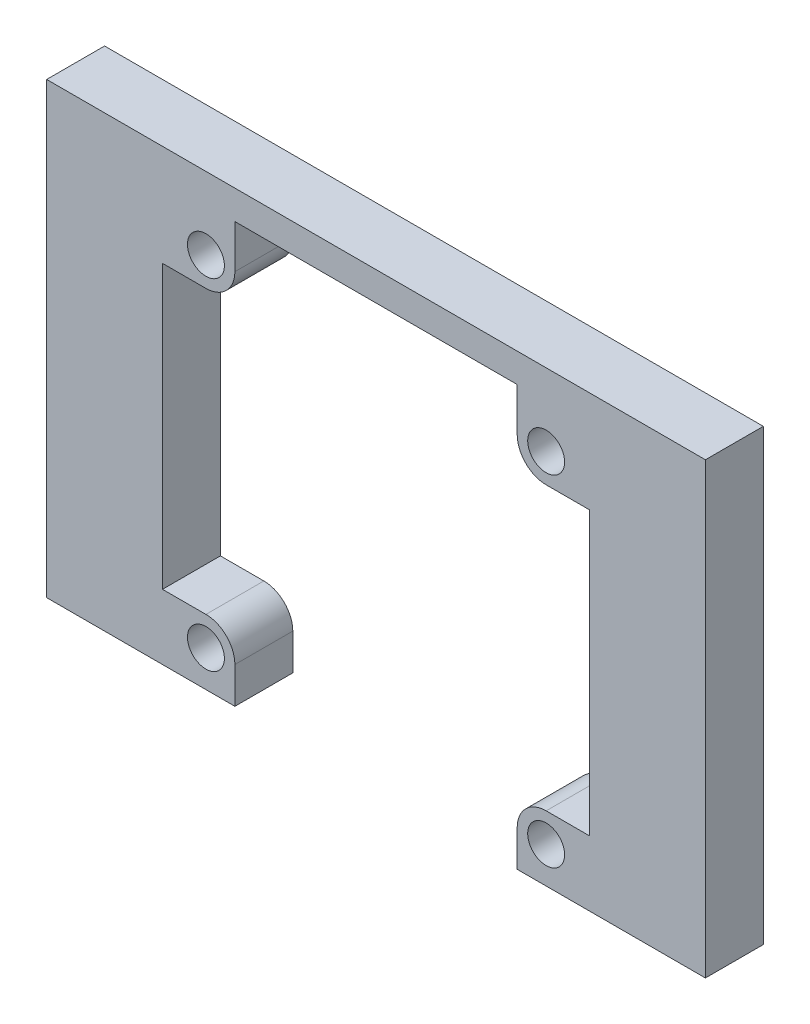
ISO-10303-21;
HEADER;
FILE_DESCRIPTION(('STEP AP214'),'2;1');
FILE_NAME('part.step','',(''),(''),'','','');
FILE_SCHEMA(('AUTOMOTIVE_DESIGN { 1 0 10303 214 1 1 1 1 }'));
ENDSEC;
DATA;
#1=APPLICATION_CONTEXT('core data for automotive mechanical design processes');
#2=APPLICATION_PROTOCOL_DEFINITION('international standard','automotive_design',2000,#1);
#3=PRODUCT_CONTEXT('',#1,'mechanical');
#4=PRODUCT('Part','Part','',(#3));
#5=PRODUCT_RELATED_PRODUCT_CATEGORY('part','',(#4));
#6=PRODUCT_DEFINITION_FORMATION('','',#4);
#7=PRODUCT_DEFINITION_CONTEXT('part definition',#1,'design');
#8=PRODUCT_DEFINITION('design','',#6,#7);
#9=PRODUCT_DEFINITION_SHAPE('','',#8);
#10=(LENGTH_UNIT() NAMED_UNIT(*) SI_UNIT(.MILLI.,.METRE.));
#11=(NAMED_UNIT(*) PLANE_ANGLE_UNIT() SI_UNIT($,.RADIAN.));
#12=(NAMED_UNIT(*) SI_UNIT($,.STERADIAN.) SOLID_ANGLE_UNIT());
#13=UNCERTAINTY_MEASURE_WITH_UNIT(LENGTH_MEASURE(1.E-05),#10,'distance_accuracy_value','');
#14=(GEOMETRIC_REPRESENTATION_CONTEXT(3) GLOBAL_UNCERTAINTY_ASSIGNED_CONTEXT((#13)) GLOBAL_UNIT_ASSIGNED_CONTEXT((#10,
#11,#12)) REPRESENTATION_CONTEXT('',''));
#15=CARTESIAN_POINT('',(0.,0.,0.));
#16=DIRECTION('',(0.,0.,1.));
#17=DIRECTION('',(1.,0.,0.));
#18=AXIS2_PLACEMENT_3D('',#15,#16,#17);
#19=CARTESIAN_POINT('',(45.5,0.,8.));
#20=DIRECTION('',(-1.,0.,0.));
#21=DIRECTION('',(0.,0.,1.));
#22=AXIS2_PLACEMENT_3D('',#19,#20,#21);
#23=PLANE('',#22);
#24=DIRECTION('',(0.,1.,0.));
#25=VECTOR('',#24,1.);
#26=CARTESIAN_POINT('',(45.5,0.,0.));
#27=LINE('',#26,#25);
#28=CARTESIAN_POINT('',(45.5,25.95,0.));
#29=VERTEX_POINT('',#28);
#30=CARTESIAN_POINT('',(45.5,87.95,0.));
#31=VERTEX_POINT('',#30);
#32=EDGE_CURVE('E221',#29,#31,#27,.T.);
#33=ORIENTED_EDGE('',*,*,#32,.T.);
#34=DIRECTION('',(0.,0.,-1.));
#35=VECTOR('',#34,1.);
#36=CARTESIAN_POINT('',(45.5,87.95,8.));
#37=LINE('',#36,#35);
#38=CARTESIAN_POINT('',(45.5,87.95,8.));
#39=VERTEX_POINT('',#38);
#40=EDGE_CURVE('E11',#39,#31,#37,.T.);
#41=ORIENTED_EDGE('',*,*,#40,.F.);
#42=DIRECTION('',(0.,1.,0.));
#43=VECTOR('',#42,1.);
#44=CARTESIAN_POINT('',(45.5,0.,8.));
#45=LINE('',#44,#43);
#46=CARTESIAN_POINT('',(45.5,25.95,8.));
#47=VERTEX_POINT('',#46);
#48=EDGE_CURVE('E133',#47,#39,#45,.T.);
#49=ORIENTED_EDGE('',*,*,#48,.F.);
#50=DIRECTION('',(0.,0.,-1.));
#51=VECTOR('',#50,1.);
#52=CARTESIAN_POINT('',(45.5,25.95,8.));
#53=LINE('',#52,#51);
#54=EDGE_CURVE('E220',#47,#29,#53,.T.);
#55=ORIENTED_EDGE('',*,*,#54,.T.);
#56=EDGE_LOOP('',(#33,#41,#49,#55));
#57=FACE_BOUND('',#56,.T.);
#58=ADVANCED_FACE('F41',(#57),#23,.F.);
#59=CARTESIAN_POINT('',(0.,87.95,8.));
#60=DIRECTION('',(0.,1.,0.));
#61=DIRECTION('',(0.,0.,1.));
#62=AXIS2_PLACEMENT_3D('',#59,#60,#61);
#63=PLANE('',#62);
#64=DIRECTION('',(1.,0.,0.));
#65=VECTOR('',#64,1.);
#66=CARTESIAN_POINT('',(0.,87.95,0.));
#67=LINE('',#66,#65);
#68=CARTESIAN_POINT('',(-45.5,87.95,0.));
#69=VERTEX_POINT('',#68);
#70=EDGE_CURVE('E224',#69,#31,#67,.T.);
#71=ORIENTED_EDGE('',*,*,#70,.F.);
#72=DIRECTION('',(0.,0.,-1.));
#73=VECTOR('',#72,1.);
#74=CARTESIAN_POINT('',(-45.5,87.95,8.));
#75=LINE('',#74,#73);
#76=CARTESIAN_POINT('',(-45.5,87.95,8.));
#77=VERTEX_POINT('',#76);
#78=EDGE_CURVE('E49',#77,#69,#75,.T.);
#79=ORIENTED_EDGE('',*,*,#78,.F.);
#80=DIRECTION('',(1.,0.,0.));
#81=VECTOR('',#80,1.);
#82=CARTESIAN_POINT('',(0.,87.95,8.));
#83=LINE('',#82,#81);
#84=EDGE_CURVE('E341',#77,#39,#83,.T.);
#85=ORIENTED_EDGE('',*,*,#84,.T.);
#86=ORIENTED_EDGE('',*,*,#40,.T.);
#87=EDGE_LOOP('',(#71,#79,#85,#86));
#88=FACE_BOUND('',#87,.T.);
#89=ADVANCED_FACE('F326',(#88),#63,.T.);
#90=CARTESIAN_POINT('',(-45.5,0.,8.));
#91=DIRECTION('',(-1.,0.,0.));
#92=DIRECTION('',(0.,0.,1.));
#93=AXIS2_PLACEMENT_3D('',#90,#91,#92);
#94=PLANE('',#93);
#95=DIRECTION('',(0.,1.,0.));
#96=VECTOR('',#95,1.);
#97=CARTESIAN_POINT('',(-45.5,0.,0.));
#98=LINE('',#97,#96);
#99=CARTESIAN_POINT('',(-45.5,25.95,0.));
#100=VERTEX_POINT('',#99);
#101=EDGE_CURVE('E227',#100,#69,#98,.T.);
#102=ORIENTED_EDGE('',*,*,#101,.F.);
#103=DIRECTION('',(0.,0.,-1.));
#104=VECTOR('',#103,1.);
#105=CARTESIAN_POINT('',(-45.5,25.95,8.));
#106=LINE('',#105,#104);
#107=CARTESIAN_POINT('',(-45.5,25.95,8.));
#108=VERTEX_POINT('',#107);
#109=EDGE_CURVE('E316',#108,#100,#106,.T.);
#110=ORIENTED_EDGE('',*,*,#109,.F.);
#111=DIRECTION('',(0.,1.,0.));
#112=VECTOR('',#111,1.);
#113=CARTESIAN_POINT('',(-45.5,0.,8.));
#114=LINE('',#113,#112);
#115=EDGE_CURVE('E323',#108,#77,#114,.T.);
#116=ORIENTED_EDGE('',*,*,#115,.T.);
#117=ORIENTED_EDGE('',*,*,#78,.T.);
#118=EDGE_LOOP('',(#102,#110,#116,#117));
#119=FACE_BOUND('',#118,.T.);
#120=ADVANCED_FACE('F321',(#119),#94,.T.);
#121=CARTESIAN_POINT('',(0.,25.95,8.));
#122=DIRECTION('',(0.,-1.,0.));
#123=DIRECTION('',(0.,0.,-1.));
#124=AXIS2_PLACEMENT_3D('',#121,#122,#123);
#125=PLANE('',#124);
#126=DIRECTION('',(-1.,0.,0.));
#127=VECTOR('',#126,1.);
#128=CARTESIAN_POINT('',(0.,25.95,0.));
#129=LINE('',#128,#127);
#130=CARTESIAN_POINT('',(-19.5,25.95,0.));
#131=VERTEX_POINT('',#130);
#132=EDGE_CURVE('E230',#131,#100,#129,.T.);
#133=ORIENTED_EDGE('',*,*,#132,.F.);
#134=DIRECTION('',(0.,0.,-1.));
#135=VECTOR('',#134,1.);
#136=CARTESIAN_POINT('',(-19.5,25.95,8.));
#137=LINE('',#136,#135);
#138=CARTESIAN_POINT('',(-19.5,25.95,8.));
#139=VERTEX_POINT('',#138);
#140=EDGE_CURVE('E314',#139,#131,#137,.T.);
#141=ORIENTED_EDGE('',*,*,#140,.F.);
#142=DIRECTION('',(-1.,0.,0.));
#143=VECTOR('',#142,1.);
#144=CARTESIAN_POINT('',(0.,25.95,8.));
#145=LINE('',#144,#143);
#146=EDGE_CURVE('E338',#139,#108,#145,.T.);
#147=ORIENTED_EDGE('',*,*,#146,.T.);
#148=ORIENTED_EDGE('',*,*,#109,.T.);
#149=EDGE_LOOP('',(#133,#141,#147,#148));
#150=FACE_BOUND('',#149,.T.);
#151=ADVANCED_FACE('F335',(#150),#125,.T.);
#152=CARTESIAN_POINT('',(-19.5,0.,8.));
#153=DIRECTION('',(1.,0.,0.));
#154=DIRECTION('',(0.,0.,-1.));
#155=AXIS2_PLACEMENT_3D('',#152,#153,#154);
#156=PLANE('',#155);
#157=DIRECTION('',(0.,-1.,0.));
#158=VECTOR('',#157,1.);
#159=CARTESIAN_POINT('',(-19.5,0.,0.));
#160=LINE('',#159,#158);
#161=CARTESIAN_POINT('',(-19.5,30.95,0.));
#162=VERTEX_POINT('',#161);
#163=EDGE_CURVE('E233',#162,#131,#160,.T.);
#164=ORIENTED_EDGE('',*,*,#163,.F.);
#165=DIRECTION('',(0.,0.,-1.));
#166=VECTOR('',#165,1.);
#167=CARTESIAN_POINT('',(-19.5,30.95,8.));
#168=LINE('',#167,#166);
#169=CARTESIAN_POINT('',(-19.5,30.95,8.));
#170=VERTEX_POINT('',#169);
#171=EDGE_CURVE('E312',#170,#162,#168,.T.);
#172=ORIENTED_EDGE('',*,*,#171,.F.);
#173=DIRECTION('',(0.,-1.,0.));
#174=VECTOR('',#173,1.);
#175=CARTESIAN_POINT('',(-19.5,0.,8.));
#176=LINE('',#175,#174);
#177=EDGE_CURVE('E343',#170,#139,#176,.T.);
#178=ORIENTED_EDGE('',*,*,#177,.T.);
#179=ORIENTED_EDGE('',*,*,#140,.T.);
#180=EDGE_LOOP('',(#164,#172,#178,#179));
#181=FACE_BOUND('',#180,.T.);
#182=ADVANCED_FACE('F405',(#181),#156,.T.);
#183=CARTESIAN_POINT('',(-23.5,30.95,8.));
#184=DIRECTION('',(0.,0.,-1.));
#185=DIRECTION('',(-1.,0.,0.));
#186=AXIS2_PLACEMENT_3D('',#183,#184,#185);
#187=CYLINDRICAL_SURFACE('',#186,4.);
#188=CARTESIAN_POINT('',(-23.5,30.95,0.));
#189=DIRECTION('',(0.,0.,1.));
#190=DIRECTION('',(1.,0.,0.));
#191=AXIS2_PLACEMENT_3D('',#188,#189,#190);
#192=CIRCLE('',#191,4.);
#193=CARTESIAN_POINT('',(-23.5,34.95,0.));
#194=VERTEX_POINT('',#193);
#195=EDGE_CURVE('E236',#162,#194,#192,.T.);
#196=ORIENTED_EDGE('',*,*,#195,.T.);
#197=DIRECTION('',(0.,0.,-1.));
#198=VECTOR('',#197,1.);
#199=CARTESIAN_POINT('',(-23.5,34.95,8.));
#200=LINE('',#199,#198);
#201=CARTESIAN_POINT('',(-23.5,34.95,8.));
#202=VERTEX_POINT('',#201);
#203=EDGE_CURVE('E309',#202,#194,#200,.T.);
#204=ORIENTED_EDGE('',*,*,#203,.F.);
#205=CARTESIAN_POINT('',(-23.5,30.95,8.));
#206=DIRECTION('',(0.,0.,1.));
#207=DIRECTION('',(1.,0.,0.));
#208=AXIS2_PLACEMENT_3D('',#205,#206,#207);
#209=CIRCLE('',#208,4.);
#210=EDGE_CURVE('E349',#170,#202,#209,.T.);
#211=ORIENTED_EDGE('',*,*,#210,.F.);
#212=ORIENTED_EDGE('',*,*,#171,.T.);
#213=EDGE_LOOP('',(#196,#204,#211,#212));
#214=FACE_BOUND('',#213,.T.);
#215=ADVANCED_FACE('F408',(#214),#187,.T.);
#216=CARTESIAN_POINT('',(0.,34.95,8.));
#217=DIRECTION('',(0.,-1.,0.));
#218=DIRECTION('',(0.,0.,-1.));
#219=AXIS2_PLACEMENT_3D('',#216,#217,#218);
#220=PLANE('',#219);
#221=DIRECTION('',(-1.,0.,0.));
#222=VECTOR('',#221,1.);
#223=CARTESIAN_POINT('',(0.,34.95,0.));
#224=LINE('',#223,#222);
#225=CARTESIAN_POINT('',(-29.5,34.95,0.));
#226=VERTEX_POINT('',#225);
#227=EDGE_CURVE('E238',#194,#226,#224,.T.);
#228=ORIENTED_EDGE('',*,*,#227,.T.);
#229=DIRECTION('',(0.,0.,-1.));
#230=VECTOR('',#229,1.);
#231=CARTESIAN_POINT('',(-29.5,34.95,8.));
#232=LINE('',#231,#230);
#233=CARTESIAN_POINT('',(-29.5,34.95,8.));
#234=VERTEX_POINT('',#233);
#235=EDGE_CURVE('E307',#234,#226,#232,.T.);
#236=ORIENTED_EDGE('',*,*,#235,.F.);
#237=DIRECTION('',(-1.,0.,0.));
#238=VECTOR('',#237,1.);
#239=CARTESIAN_POINT('',(0.,34.95,8.));
#240=LINE('',#239,#238);
#241=EDGE_CURVE('E351',#202,#234,#240,.T.);
#242=ORIENTED_EDGE('',*,*,#241,.F.);
#243=ORIENTED_EDGE('',*,*,#203,.T.);
#244=EDGE_LOOP('',(#228,#236,#242,#243));
#245=FACE_BOUND('',#244,.T.);
#246=ADVANCED_FACE('F412',(#245),#220,.F.);
#247=CARTESIAN_POINT('',(-29.5,0.,8.));
#248=DIRECTION('',(1.,0.,0.));
#249=DIRECTION('',(0.,0.,-1.));
#250=AXIS2_PLACEMENT_3D('',#247,#248,#249);
#251=PLANE('',#250);
#252=DIRECTION('',(0.,-1.,0.));
#253=VECTOR('',#252,1.);
#254=CARTESIAN_POINT('',(-29.5,0.,0.));
#255=LINE('',#254,#253);
#256=CARTESIAN_POINT('',(-29.5,73.95,0.));
#257=VERTEX_POINT('',#256);
#258=EDGE_CURVE('E241',#257,#226,#255,.T.);
#259=ORIENTED_EDGE('',*,*,#258,.F.);
#260=DIRECTION('',(0.,0.,-1.));
#261=VECTOR('',#260,1.);
#262=CARTESIAN_POINT('',(-29.5,73.95,8.));
#263=LINE('',#262,#261);
#264=CARTESIAN_POINT('',(-29.5,73.95,8.));
#265=VERTEX_POINT('',#264);
#266=EDGE_CURVE('E305',#265,#257,#263,.T.);
#267=ORIENTED_EDGE('',*,*,#266,.F.);
#268=DIRECTION('',(0.,-1.,0.));
#269=VECTOR('',#268,1.);
#270=CARTESIAN_POINT('',(-29.5,0.,8.));
#271=LINE('',#270,#269);
#272=EDGE_CURVE('E353',#265,#234,#271,.T.);
#273=ORIENTED_EDGE('',*,*,#272,.T.);
#274=ORIENTED_EDGE('',*,*,#235,.T.);
#275=EDGE_LOOP('',(#259,#267,#273,#274));
#276=FACE_BOUND('',#275,.T.);
#277=ADVANCED_FACE('F416',(#276),#251,.T.);
#278=CARTESIAN_POINT('',(0.,73.95,8.));
#279=DIRECTION('',(0.,-1.,0.));
#280=DIRECTION('',(0.,0.,-1.));
#281=AXIS2_PLACEMENT_3D('',#278,#279,#280);
#282=PLANE('',#281);
#283=DIRECTION('',(-1.,0.,0.));
#284=VECTOR('',#283,1.);
#285=CARTESIAN_POINT('',(0.,73.95,0.));
#286=LINE('',#285,#284);
#287=CARTESIAN_POINT('',(-23.5,73.95,0.));
#288=VERTEX_POINT('',#287);
#289=EDGE_CURVE('E244',#288,#257,#286,.T.);
#290=ORIENTED_EDGE('',*,*,#289,.F.);
#291=DIRECTION('',(0.,0.,-1.));
#292=VECTOR('',#291,1.);
#293=CARTESIAN_POINT('',(-23.5,73.95,8.));
#294=LINE('',#293,#292);
#295=CARTESIAN_POINT('',(-23.5,73.95,8.));
#296=VERTEX_POINT('',#295);
#297=EDGE_CURVE('E303',#296,#288,#294,.T.);
#298=ORIENTED_EDGE('',*,*,#297,.F.);
#299=DIRECTION('',(-1.,0.,0.));
#300=VECTOR('',#299,1.);
#301=CARTESIAN_POINT('',(0.,73.95,8.));
#302=LINE('',#301,#300);
#303=EDGE_CURVE('E356',#296,#265,#302,.T.);
#304=ORIENTED_EDGE('',*,*,#303,.T.);
#305=ORIENTED_EDGE('',*,*,#266,.T.);
#306=EDGE_LOOP('',(#290,#298,#304,#305));
#307=FACE_BOUND('',#306,.T.);
#308=ADVANCED_FACE('F420',(#307),#282,.T.);
#309=CARTESIAN_POINT('',(-23.5,77.95,8.));
#310=DIRECTION('',(0.,0.,-1.));
#311=DIRECTION('',(-1.,0.,0.));
#312=AXIS2_PLACEMENT_3D('',#309,#310,#311);
#313=CYLINDRICAL_SURFACE('',#312,4.);
#314=CARTESIAN_POINT('',(-23.5,77.95,0.));
#315=DIRECTION('',(0.,0.,1.));
#316=DIRECTION('',(1.,0.,0.));
#317=AXIS2_PLACEMENT_3D('',#314,#315,#316);
#318=CIRCLE('',#317,4.);
#319=CARTESIAN_POINT('',(-19.5,77.95,0.));
#320=VERTEX_POINT('',#319);
#321=EDGE_CURVE('E247',#288,#320,#318,.T.);
#322=ORIENTED_EDGE('',*,*,#321,.T.);
#323=DIRECTION('',(0.,0.,-1.));
#324=VECTOR('',#323,1.);
#325=CARTESIAN_POINT('',(-19.5,77.95,8.));
#326=LINE('',#325,#324);
#327=CARTESIAN_POINT('',(-19.5,77.95,8.));
#328=VERTEX_POINT('',#327);
#329=EDGE_CURVE('E300',#328,#320,#326,.T.);
#330=ORIENTED_EDGE('',*,*,#329,.F.);
#331=CARTESIAN_POINT('',(-23.5,77.95,8.));
#332=DIRECTION('',(0.,0.,1.));
#333=DIRECTION('',(1.,0.,0.));
#334=AXIS2_PLACEMENT_3D('',#331,#332,#333);
#335=CIRCLE('',#334,4.);
#336=EDGE_CURVE('E359',#296,#328,#335,.T.);
#337=ORIENTED_EDGE('',*,*,#336,.F.);
#338=ORIENTED_EDGE('',*,*,#297,.T.);
#339=EDGE_LOOP('',(#322,#330,#337,#338));
#340=FACE_BOUND('',#339,.T.);
#341=ADVANCED_FACE('F424',(#340),#313,.T.);
#342=CARTESIAN_POINT('',(-19.5,0.,8.));
#343=DIRECTION('',(-1.,0.,0.));
#344=DIRECTION('',(0.,0.,1.));
#345=AXIS2_PLACEMENT_3D('',#342,#343,#344);
#346=PLANE('',#345);
#347=DIRECTION('',(0.,1.,0.));
#348=VECTOR('',#347,1.);
#349=CARTESIAN_POINT('',(-19.5,0.,0.));
#350=LINE('',#349,#348);
#351=CARTESIAN_POINT('',(-19.5,83.95,0.));
#352=VERTEX_POINT('',#351);
#353=EDGE_CURVE('E249',#320,#352,#350,.T.);
#354=ORIENTED_EDGE('',*,*,#353,.T.);
#355=DIRECTION('',(0.,0.,-1.));
#356=VECTOR('',#355,1.);
#357=CARTESIAN_POINT('',(-19.5,83.95,8.));
#358=LINE('',#357,#356);
#359=CARTESIAN_POINT('',(-19.5,83.95,8.));
#360=VERTEX_POINT('',#359);
#361=EDGE_CURVE('E297',#360,#352,#358,.T.);
#362=ORIENTED_EDGE('',*,*,#361,.F.);
#363=DIRECTION('',(0.,1.,0.));
#364=VECTOR('',#363,1.);
#365=CARTESIAN_POINT('',(-19.5,0.,8.));
#366=LINE('',#365,#364);
#367=EDGE_CURVE('E361',#328,#360,#366,.T.);
#368=ORIENTED_EDGE('',*,*,#367,.F.);
#369=ORIENTED_EDGE('',*,*,#329,.T.);
#370=EDGE_LOOP('',(#354,#362,#368,#369));
#371=FACE_BOUND('',#370,.T.);
#372=ADVANCED_FACE('F428',(#371),#346,.F.);
#373=CARTESIAN_POINT('',(0.,83.95,8.));
#374=DIRECTION('',(0.,1.,0.));
#375=DIRECTION('',(0.,0.,1.));
#376=AXIS2_PLACEMENT_3D('',#373,#374,#375);
#377=PLANE('',#376);
#378=DIRECTION('',(1.,0.,0.));
#379=VECTOR('',#378,1.);
#380=CARTESIAN_POINT('',(0.,83.95,0.));
#381=LINE('',#380,#379);
#382=CARTESIAN_POINT('',(19.5,83.95,0.));
#383=VERTEX_POINT('',#382);
#384=EDGE_CURVE('E251',#352,#383,#381,.T.);
#385=ORIENTED_EDGE('',*,*,#384,.T.);
#386=DIRECTION('',(0.,0.,-1.));
#387=VECTOR('',#386,1.);
#388=CARTESIAN_POINT('',(19.5,83.95,8.));
#389=LINE('',#388,#387);
#390=CARTESIAN_POINT('',(19.5,83.95,8.));
#391=VERTEX_POINT('',#390);
#392=EDGE_CURVE('E295',#391,#383,#389,.T.);
#393=ORIENTED_EDGE('',*,*,#392,.F.);
#394=DIRECTION('',(1.,0.,0.));
#395=VECTOR('',#394,1.);
#396=CARTESIAN_POINT('',(0.,83.95,8.));
#397=LINE('',#396,#395);
#398=EDGE_CURVE('E363',#360,#391,#397,.T.);
#399=ORIENTED_EDGE('',*,*,#398,.F.);
#400=ORIENTED_EDGE('',*,*,#361,.T.);
#401=EDGE_LOOP('',(#385,#393,#399,#400));
#402=FACE_BOUND('',#401,.T.);
#403=ADVANCED_FACE('F432',(#402),#377,.F.);
#404=CARTESIAN_POINT('',(19.5,0.,8.));
#405=DIRECTION('',(-1.,0.,0.));
#406=DIRECTION('',(0.,-1.,0.));
#407=AXIS2_PLACEMENT_3D('',#404,#405,#406);
#408=PLANE('',#407);
#409=DIRECTION('',(0.,1.,0.));
#410=VECTOR('',#409,1.);
#411=CARTESIAN_POINT('',(19.5,0.,0.));
#412=LINE('',#411,#410);
#413=CARTESIAN_POINT('',(19.5,77.95,0.));
#414=VERTEX_POINT('',#413);
#415=EDGE_CURVE('E254',#414,#383,#412,.T.);
#416=ORIENTED_EDGE('',*,*,#415,.F.);
#417=DIRECTION('',(0.,0.,-1.));
#418=VECTOR('',#417,1.);
#419=CARTESIAN_POINT('',(19.5,77.95,8.));
#420=LINE('',#419,#418);
#421=CARTESIAN_POINT('',(19.5,77.95,8.));
#422=VERTEX_POINT('',#421);
#423=EDGE_CURVE('E293',#422,#414,#420,.T.);
#424=ORIENTED_EDGE('',*,*,#423,.F.);
#425=DIRECTION('',(0.,1.,0.));
#426=VECTOR('',#425,1.);
#427=CARTESIAN_POINT('',(19.5,0.,8.));
#428=LINE('',#427,#426);
#429=EDGE_CURVE('E365',#422,#391,#428,.T.);
#430=ORIENTED_EDGE('',*,*,#429,.T.);
#431=ORIENTED_EDGE('',*,*,#392,.T.);
#432=EDGE_LOOP('',(#416,#424,#430,#431));
#433=FACE_BOUND('',#432,.T.);
#434=ADVANCED_FACE('F436',(#433),#408,.T.);
#435=CARTESIAN_POINT('',(23.5,77.95,8.));
#436=DIRECTION('',(0.,0.,-1.));
#437=DIRECTION('',(-1.,0.,0.));
#438=AXIS2_PLACEMENT_3D('',#435,#436,#437);
#439=CYLINDRICAL_SURFACE('',#438,4.);
#440=CARTESIAN_POINT('',(23.5,77.95,0.));
#441=DIRECTION('',(0.,0.,1.));
#442=DIRECTION('',(1.,0.,0.));
#443=AXIS2_PLACEMENT_3D('',#440,#441,#442);
#444=CIRCLE('',#443,4.);
#445=CARTESIAN_POINT('',(23.5,73.95,0.));
#446=VERTEX_POINT('',#445);
#447=EDGE_CURVE('E257',#414,#446,#444,.T.);
#448=ORIENTED_EDGE('',*,*,#447,.T.);
#449=DIRECTION('',(0.,0.,-1.));
#450=VECTOR('',#449,1.);
#451=CARTESIAN_POINT('',(23.5,73.95,8.));
#452=LINE('',#451,#450);
#453=CARTESIAN_POINT('',(23.5,73.95,8.));
#454=VERTEX_POINT('',#453);
#455=EDGE_CURVE('E290',#454,#446,#452,.T.);
#456=ORIENTED_EDGE('',*,*,#455,.F.);
#457=CARTESIAN_POINT('',(23.5,77.95,8.));
#458=DIRECTION('',(0.,0.,1.));
#459=DIRECTION('',(1.,0.,0.));
#460=AXIS2_PLACEMENT_3D('',#457,#458,#459);
#461=CIRCLE('',#460,4.);
#462=EDGE_CURVE('E368',#422,#454,#461,.T.);
#463=ORIENTED_EDGE('',*,*,#462,.F.);
#464=ORIENTED_EDGE('',*,*,#423,.T.);
#465=EDGE_LOOP('',(#448,#456,#463,#464));
#466=FACE_BOUND('',#465,.T.);
#467=ADVANCED_FACE('F440',(#466),#439,.T.);
#468=CARTESIAN_POINT('',(0.,73.95,8.));
#469=DIRECTION('',(0.,1.,0.));
#470=DIRECTION('',(0.,0.,1.));
#471=AXIS2_PLACEMENT_3D('',#468,#469,#470);
#472=PLANE('',#471);
#473=DIRECTION('',(1.,0.,0.));
#474=VECTOR('',#473,1.);
#475=CARTESIAN_POINT('',(0.,73.95,0.));
#476=LINE('',#475,#474);
#477=CARTESIAN_POINT('',(29.5,73.95,0.));
#478=VERTEX_POINT('',#477);
#479=EDGE_CURVE('E259',#446,#478,#476,.T.);
#480=ORIENTED_EDGE('',*,*,#479,.T.);
#481=DIRECTION('',(0.,0.,-1.));
#482=VECTOR('',#481,1.);
#483=CARTESIAN_POINT('',(29.5,73.95,8.));
#484=LINE('',#483,#482);
#485=CARTESIAN_POINT('',(29.5,73.95,8.));
#486=VERTEX_POINT('',#485);
#487=EDGE_CURVE('E288',#486,#478,#484,.T.);
#488=ORIENTED_EDGE('',*,*,#487,.F.);
#489=DIRECTION('',(1.,0.,0.));
#490=VECTOR('',#489,1.);
#491=CARTESIAN_POINT('',(0.,73.95,8.));
#492=LINE('',#491,#490);
#493=EDGE_CURVE('E370',#454,#486,#492,.T.);
#494=ORIENTED_EDGE('',*,*,#493,.F.);
#495=ORIENTED_EDGE('',*,*,#455,.T.);
#496=EDGE_LOOP('',(#480,#488,#494,#495));
#497=FACE_BOUND('',#496,.T.);
#498=ADVANCED_FACE('F444',(#497),#472,.F.);
#499=CARTESIAN_POINT('',(29.5,0.,8.));
#500=DIRECTION('',(-1.,0.,0.));
#501=DIRECTION('',(0.,0.,1.));
#502=AXIS2_PLACEMENT_3D('',#499,#500,#501);
#503=PLANE('',#502);
#504=DIRECTION('',(0.,1.,0.));
#505=VECTOR('',#504,1.);
#506=CARTESIAN_POINT('',(29.5,0.,0.));
#507=LINE('',#506,#505);
#508=CARTESIAN_POINT('',(29.5,34.95,0.));
#509=VERTEX_POINT('',#508);
#510=EDGE_CURVE('E262',#509,#478,#507,.T.);
#511=ORIENTED_EDGE('',*,*,#510,.F.);
#512=DIRECTION('',(0.,0.,-1.));
#513=VECTOR('',#512,1.);
#514=CARTESIAN_POINT('',(29.5,34.95,8.));
#515=LINE('',#514,#513);
#516=CARTESIAN_POINT('',(29.5,34.95,8.));
#517=VERTEX_POINT('',#516);
#518=EDGE_CURVE('E286',#517,#509,#515,.T.);
#519=ORIENTED_EDGE('',*,*,#518,.F.);
#520=DIRECTION('',(0.,1.,0.));
#521=VECTOR('',#520,1.);
#522=CARTESIAN_POINT('',(29.5,0.,8.));
#523=LINE('',#522,#521);
#524=EDGE_CURVE('E372',#517,#486,#523,.T.);
#525=ORIENTED_EDGE('',*,*,#524,.T.);
#526=ORIENTED_EDGE('',*,*,#487,.T.);
#527=EDGE_LOOP('',(#511,#519,#525,#526));
#528=FACE_BOUND('',#527,.T.);
#529=ADVANCED_FACE('F448',(#528),#503,.T.);
#530=CARTESIAN_POINT('',(0.,34.95,8.));
#531=DIRECTION('',(0.,1.,0.));
#532=DIRECTION('',(0.,0.,1.));
#533=AXIS2_PLACEMENT_3D('',#530,#531,#532);
#534=PLANE('',#533);
#535=DIRECTION('',(1.,0.,0.));
#536=VECTOR('',#535,1.);
#537=CARTESIAN_POINT('',(0.,34.95,0.));
#538=LINE('',#537,#536);
#539=CARTESIAN_POINT('',(23.5,34.95,0.));
#540=VERTEX_POINT('',#539);
#541=EDGE_CURVE('E265',#540,#509,#538,.T.);
#542=ORIENTED_EDGE('',*,*,#541,.F.);
#543=DIRECTION('',(0.,0.,-1.));
#544=VECTOR('',#543,1.);
#545=CARTESIAN_POINT('',(23.5,34.95,8.));
#546=LINE('',#545,#544);
#547=CARTESIAN_POINT('',(23.5,34.95,8.));
#548=VERTEX_POINT('',#547);
#549=EDGE_CURVE('E200',#548,#540,#546,.T.);
#550=ORIENTED_EDGE('',*,*,#549,.F.);
#551=DIRECTION('',(1.,0.,0.));
#552=VECTOR('',#551,1.);
#553=CARTESIAN_POINT('',(0.,34.95,8.));
#554=LINE('',#553,#552);
#555=EDGE_CURVE('E193',#548,#517,#554,.T.);
#556=ORIENTED_EDGE('',*,*,#555,.T.);
#557=ORIENTED_EDGE('',*,*,#518,.T.);
#558=EDGE_LOOP('',(#542,#550,#556,#557));
#559=FACE_BOUND('',#558,.T.);
#560=ADVANCED_FACE('F376',(#559),#534,.T.);
#561=CARTESIAN_POINT('',(23.5,30.95,8.));
#562=DIRECTION('',(0.,0.,-1.));
#563=DIRECTION('',(-1.,0.,0.));
#564=AXIS2_PLACEMENT_3D('',#561,#562,#563);
#565=CYLINDRICAL_SURFACE('',#564,4.);
#566=CARTESIAN_POINT('',(23.5,30.95,0.));
#567=DIRECTION('',(0.,0.,1.));
#568=DIRECTION('',(1.,0.,0.));
#569=AXIS2_PLACEMENT_3D('',#566,#567,#568);
#570=CIRCLE('',#569,4.);
#571=CARTESIAN_POINT('',(19.5,30.95,0.));
#572=VERTEX_POINT('',#571);
#573=EDGE_CURVE('E199',#540,#572,#570,.T.);
#574=ORIENTED_EDGE('',*,*,#573,.T.);
#575=DIRECTION('',(0.,0.,-1.));
#576=VECTOR('',#575,1.);
#577=CARTESIAN_POINT('',(19.5,30.95,8.));
#578=LINE('',#577,#576);
#579=CARTESIAN_POINT('',(19.5,30.95,8.));
#580=VERTEX_POINT('',#579);
#581=EDGE_CURVE('E196',#580,#572,#578,.T.);
#582=ORIENTED_EDGE('',*,*,#581,.F.);
#583=CARTESIAN_POINT('',(23.5,30.95,8.));
#584=DIRECTION('',(0.,0.,1.));
#585=DIRECTION('',(1.,0.,0.));
#586=AXIS2_PLACEMENT_3D('',#583,#584,#585);
#587=CIRCLE('',#586,4.);
#588=EDGE_CURVE('E185',#548,#580,#587,.T.);
#589=ORIENTED_EDGE('',*,*,#588,.F.);
#590=ORIENTED_EDGE('',*,*,#549,.T.);
#591=EDGE_LOOP('',(#574,#582,#589,#590));
#592=FACE_BOUND('',#591,.T.);
#593=ADVANCED_FACE('F197',(#592),#565,.T.);
#594=CARTESIAN_POINT('',(19.5,0.,8.));
#595=DIRECTION('',(1.,0.,0.));
#596=DIRECTION('',(0.,0.,-1.));
#597=AXIS2_PLACEMENT_3D('',#594,#595,#596);
#598=PLANE('',#597);
#599=DIRECTION('',(0.,-1.,0.));
#600=VECTOR('',#599,1.);
#601=CARTESIAN_POINT('',(19.5,0.,0.));
#602=LINE('',#601,#600);
#603=CARTESIAN_POINT('',(19.5,25.95,0.));
#604=VERTEX_POINT('',#603);
#605=EDGE_CURVE('E121',#572,#604,#602,.T.);
#606=ORIENTED_EDGE('',*,*,#605,.T.);
#607=DIRECTION('',(0.,0.,-1.));
#608=VECTOR('',#607,1.);
#609=CARTESIAN_POINT('',(19.5,25.95,8.));
#610=LINE('',#609,#608);
#611=CARTESIAN_POINT('',(19.5,25.95,8.));
#612=VERTEX_POINT('',#611);
#613=EDGE_CURVE('E201',#612,#604,#610,.T.);
#614=ORIENTED_EDGE('',*,*,#613,.F.);
#615=DIRECTION('',(0.,-1.,0.));
#616=VECTOR('',#615,1.);
#617=CARTESIAN_POINT('',(19.5,0.,8.));
#618=LINE('',#617,#616);
#619=EDGE_CURVE('E190',#580,#612,#618,.T.);
#620=ORIENTED_EDGE('',*,*,#619,.F.);
#621=ORIENTED_EDGE('',*,*,#581,.T.);
#622=EDGE_LOOP('',(#606,#614,#620,#621));
#623=FACE_BOUND('',#622,.T.);
#624=ADVANCED_FACE('F203',(#623),#598,.F.);
#625=CARTESIAN_POINT('',(23.5,30.95,8.));
#626=DIRECTION('',(0.,0.,-1.));
#627=DIRECTION('',(-1.,0.,0.));
#628=AXIS2_PLACEMENT_3D('',#625,#626,#627);
#629=CYLINDRICAL_SURFACE('',#628,2.55000000000001);
#630=CARTESIAN_POINT('',(23.5,30.95,8.));
#631=DIRECTION('',(0.,0.,1.));
#632=DIRECTION('',(1.,0.,0.));
#633=AXIS2_PLACEMENT_3D('',#630,#631,#632);
#634=CIRCLE('',#633,2.55000000000001);
#635=CARTESIAN_POINT('',(26.05,30.95,8.));
#636=VERTEX_POINT('',#635);
#637=EDGE_CURVE('E214',#636,#636,#634,.T.);
#638=ORIENTED_EDGE('',*,*,#637,.T.);
#639=EDGE_LOOP('',(#638));
#640=FACE_BOUND('',#639,.T.);
#641=CARTESIAN_POINT('',(23.5,30.95,0.));
#642=DIRECTION('',(0.,0.,1.));
#643=DIRECTION('',(1.,0.,0.));
#644=AXIS2_PLACEMENT_3D('',#641,#642,#643);
#645=CIRCLE('',#644,2.55000000000001);
#646=CARTESIAN_POINT('',(26.05,30.95,0.));
#647=VERTEX_POINT('',#646);
#648=EDGE_CURVE('E277',#647,#647,#645,.T.);
#649=ORIENTED_EDGE('',*,*,#648,.F.);
#650=EDGE_LOOP('',(#649));
#651=FACE_BOUND('',#650,.T.);
#652=ADVANCED_FACE('F457',(#640,#651),#629,.F.);
#653=CARTESIAN_POINT('',(-23.5,30.95,8.));
#654=DIRECTION('',(0.,0.,-1.));
#655=DIRECTION('',(-1.,0.,0.));
#656=AXIS2_PLACEMENT_3D('',#653,#654,#655);
#657=CYLINDRICAL_SURFACE('',#656,2.55);
#658=CARTESIAN_POINT('',(-23.5,30.95,8.));
#659=DIRECTION('',(0.,0.,1.));
#660=DIRECTION('',(1.,0.,0.));
#661=AXIS2_PLACEMENT_3D('',#658,#659,#660);
#662=CIRCLE('',#661,2.55);
#663=CARTESIAN_POINT('',(-20.95,30.95,8.));
#664=VERTEX_POINT('',#663);
#665=EDGE_CURVE('E211',#664,#664,#662,.T.);
#666=ORIENTED_EDGE('',*,*,#665,.T.);
#667=EDGE_LOOP('',(#666));
#668=FACE_BOUND('',#667,.T.);
#669=CARTESIAN_POINT('',(-23.5,30.95,0.));
#670=DIRECTION('',(0.,0.,1.));
#671=DIRECTION('',(1.,0.,0.));
#672=AXIS2_PLACEMENT_3D('',#669,#670,#671);
#673=CIRCLE('',#672,2.55);
#674=CARTESIAN_POINT('',(-20.95,30.95,0.));
#675=VERTEX_POINT('',#674);
#676=EDGE_CURVE('E274',#675,#675,#673,.T.);
#677=ORIENTED_EDGE('',*,*,#676,.F.);
#678=EDGE_LOOP('',(#677));
#679=FACE_BOUND('',#678,.T.);
#680=ADVANCED_FACE('F390',(#668,#679),#657,.F.);
#681=CARTESIAN_POINT('',(23.5,77.95,8.));
#682=DIRECTION('',(0.,0.,-1.));
#683=DIRECTION('',(-1.,0.,0.));
#684=AXIS2_PLACEMENT_3D('',#681,#682,#683);
#685=CYLINDRICAL_SURFACE('',#684,2.55000000000001);
#686=CARTESIAN_POINT('',(23.5,77.95,8.));
#687=DIRECTION('',(0.,0.,1.));
#688=DIRECTION('',(1.,0.,0.));
#689=AXIS2_PLACEMENT_3D('',#686,#687,#688);
#690=CIRCLE('',#689,2.55000000000001);
#691=CARTESIAN_POINT('',(26.05,77.95,8.));
#692=VERTEX_POINT('',#691);
#693=EDGE_CURVE('E205',#692,#692,#690,.F.);
#694=ORIENTED_EDGE('',*,*,#693,.F.);
#695=EDGE_LOOP('',(#694));
#696=FACE_BOUND('',#695,.T.);
#697=CARTESIAN_POINT('',(23.5,77.95,0.));
#698=DIRECTION('',(0.,0.,1.));
#699=DIRECTION('',(1.,0.,0.));
#700=AXIS2_PLACEMENT_3D('',#697,#698,#699);
#701=CIRCLE('',#700,2.55000000000001);
#702=CARTESIAN_POINT('',(26.05,77.95,0.));
#703=VERTEX_POINT('',#702);
#704=EDGE_CURVE('E271',#703,#703,#701,.F.);
#705=ORIENTED_EDGE('',*,*,#704,.T.);
#706=EDGE_LOOP('',(#705));
#707=FACE_BOUND('',#706,.T.);
#708=ADVANCED_FACE('F382',(#696,#707),#685,.F.);
#709=CARTESIAN_POINT('',(0.,25.95,8.));
#710=DIRECTION('',(0.,1.,0.));
#711=DIRECTION('',(0.,0.,1.));
#712=AXIS2_PLACEMENT_3D('',#709,#710,#711);
#713=PLANE('',#712);
#714=DIRECTION('',(1.,0.,0.));
#715=VECTOR('',#714,1.);
#716=CARTESIAN_POINT('',(0.,25.95,0.));
#717=LINE('',#716,#715);
#718=EDGE_CURVE('E127',#604,#29,#717,.T.);
#719=ORIENTED_EDGE('',*,*,#718,.T.);
#720=ORIENTED_EDGE('',*,*,#54,.F.);
#721=DIRECTION('',(1.,0.,0.));
#722=VECTOR('',#721,1.);
#723=CARTESIAN_POINT('',(0.,25.95,8.));
#724=LINE('',#723,#722);
#725=EDGE_CURVE('E57',#612,#47,#724,.T.);
#726=ORIENTED_EDGE('',*,*,#725,.F.);
#727=ORIENTED_EDGE('',*,*,#613,.T.);
#728=EDGE_LOOP('',(#719,#720,#726,#727));
#729=FACE_BOUND('',#728,.T.);
#730=ADVANCED_FACE('F379',(#729),#713,.F.);
#731=CARTESIAN_POINT('',(-23.5,77.95,8.));
#732=DIRECTION('',(0.,0.,-1.));
#733=DIRECTION('',(-1.,0.,0.));
#734=AXIS2_PLACEMENT_3D('',#731,#732,#733);
#735=CYLINDRICAL_SURFACE('',#734,2.55);
#736=CARTESIAN_POINT('',(-23.5,77.95,8.));
#737=DIRECTION('',(0.,0.,1.));
#738=DIRECTION('',(1.,0.,0.));
#739=AXIS2_PLACEMENT_3D('',#736,#737,#738);
#740=CIRCLE('',#739,2.55);
#741=CARTESIAN_POINT('',(-20.95,77.95,8.));
#742=VERTEX_POINT('',#741);
#743=EDGE_CURVE('E217',#742,#742,#740,.F.);
#744=ORIENTED_EDGE('',*,*,#743,.F.);
#745=EDGE_LOOP('',(#744));
#746=FACE_BOUND('',#745,.T.);
#747=CARTESIAN_POINT('',(-23.5,77.95,0.));
#748=DIRECTION('',(0.,0.,1.));
#749=DIRECTION('',(1.,0.,0.));
#750=AXIS2_PLACEMENT_3D('',#747,#748,#749);
#751=CIRCLE('',#750,2.55);
#752=CARTESIAN_POINT('',(-20.95,77.95,0.));
#753=VERTEX_POINT('',#752);
#754=EDGE_CURVE('E280',#753,#753,#751,.F.);
#755=ORIENTED_EDGE('',*,*,#754,.T.);
#756=EDGE_LOOP('',(#755));
#757=FACE_BOUND('',#756,.T.);
#758=ADVANCED_FACE('F381',(#746,#757),#735,.F.);
#759=CARTESIAN_POINT('',(0.,0.,8.));
#760=DIRECTION('',(0.,0.,1.));
#761=DIRECTION('',(1.,0.,0.));
#762=AXIS2_PLACEMENT_3D('',#759,#760,#761);
#763=PLANE('',#762);
#764=ORIENTED_EDGE('',*,*,#48,.T.);
#765=ORIENTED_EDGE('',*,*,#84,.F.);
#766=ORIENTED_EDGE('',*,*,#115,.F.);
#767=ORIENTED_EDGE('',*,*,#146,.F.);
#768=ORIENTED_EDGE('',*,*,#177,.F.);
#769=ORIENTED_EDGE('',*,*,#210,.T.);
#770=ORIENTED_EDGE('',*,*,#241,.T.);
#771=ORIENTED_EDGE('',*,*,#272,.F.);
#772=ORIENTED_EDGE('',*,*,#303,.F.);
#773=ORIENTED_EDGE('',*,*,#336,.T.);
#774=ORIENTED_EDGE('',*,*,#367,.T.);
#775=ORIENTED_EDGE('',*,*,#398,.T.);
#776=ORIENTED_EDGE('',*,*,#429,.F.);
#777=ORIENTED_EDGE('',*,*,#462,.T.);
#778=ORIENTED_EDGE('',*,*,#493,.T.);
#779=ORIENTED_EDGE('',*,*,#524,.F.);
#780=ORIENTED_EDGE('',*,*,#555,.F.);
#781=ORIENTED_EDGE('',*,*,#588,.T.);
#782=ORIENTED_EDGE('',*,*,#619,.T.);
#783=ORIENTED_EDGE('',*,*,#725,.T.);
#784=EDGE_LOOP('',(#764,#765,#766,#767,#768,#769,#770,#771,#772,#773,#774,#775,#776,#777,#778,
#779,#780,#781,#782,#783));
#785=FACE_BOUND('',#784,.T.);
#786=ORIENTED_EDGE('',*,*,#693,.T.);
#787=EDGE_LOOP('',(#786));
#788=FACE_BOUND('',#787,.T.);
#789=ORIENTED_EDGE('',*,*,#665,.F.);
#790=EDGE_LOOP('',(#789));
#791=FACE_BOUND('',#790,.T.);
#792=ORIENTED_EDGE('',*,*,#637,.F.);
#793=EDGE_LOOP('',(#792));
#794=FACE_BOUND('',#793,.T.);
#795=ORIENTED_EDGE('',*,*,#743,.T.);
#796=EDGE_LOOP('',(#795));
#797=FACE_BOUND('',#796,.T.);
#798=ADVANCED_FACE('F187',(#785,#788,#791,#794,#797),#763,.T.);
#799=CARTESIAN_POINT('',(0.,0.,0.));
#800=DIRECTION('',(0.,0.,1.));
#801=DIRECTION('',(1.,0.,0.));
#802=AXIS2_PLACEMENT_3D('',#799,#800,#801);
#803=PLANE('',#802);
#804=ORIENTED_EDGE('',*,*,#32,.F.);
#805=ORIENTED_EDGE('',*,*,#718,.F.);
#806=ORIENTED_EDGE('',*,*,#605,.F.);
#807=ORIENTED_EDGE('',*,*,#573,.F.);
#808=ORIENTED_EDGE('',*,*,#541,.T.);
#809=ORIENTED_EDGE('',*,*,#510,.T.);
#810=ORIENTED_EDGE('',*,*,#479,.F.);
#811=ORIENTED_EDGE('',*,*,#447,.F.);
#812=ORIENTED_EDGE('',*,*,#415,.T.);
#813=ORIENTED_EDGE('',*,*,#384,.F.);
#814=ORIENTED_EDGE('',*,*,#353,.F.);
#815=ORIENTED_EDGE('',*,*,#321,.F.);
#816=ORIENTED_EDGE('',*,*,#289,.T.);
#817=ORIENTED_EDGE('',*,*,#258,.T.);
#818=ORIENTED_EDGE('',*,*,#227,.F.);
#819=ORIENTED_EDGE('',*,*,#195,.F.);
#820=ORIENTED_EDGE('',*,*,#163,.T.);
#821=ORIENTED_EDGE('',*,*,#132,.T.);
#822=ORIENTED_EDGE('',*,*,#101,.T.);
#823=ORIENTED_EDGE('',*,*,#70,.T.);
#824=EDGE_LOOP('',(#804,#805,#806,#807,#808,#809,#810,#811,#812,#813,#814,#815,#816,#817,#818,
#819,#820,#821,#822,#823));
#825=FACE_BOUND('',#824,.T.);
#826=ORIENTED_EDGE('',*,*,#704,.F.);
#827=EDGE_LOOP('',(#826));
#828=FACE_BOUND('',#827,.T.);
#829=ORIENTED_EDGE('',*,*,#676,.T.);
#830=EDGE_LOOP('',(#829));
#831=FACE_BOUND('',#830,.T.);
#832=ORIENTED_EDGE('',*,*,#648,.T.);
#833=EDGE_LOOP('',(#832));
#834=FACE_BOUND('',#833,.T.);
#835=ORIENTED_EDGE('',*,*,#754,.F.);
#836=EDGE_LOOP('',(#835));
#837=FACE_BOUND('',#836,.T.);
#838=ADVANCED_FACE('F329',(#825,#828,#831,#834,#837),#803,.F.);
#839=CLOSED_SHELL('',(#58,#89,#120,#151,#182,#215,#246,#277,#308,#341,#372,#403,#434,#467,#498,
#529,#560,#593,#624,#652,#680,#708,#730,#758,#798,#838));
#840=MANIFOLD_SOLID_BREP('B2',#839);
#841=ADVANCED_BREP_SHAPE_REPRESENTATION('',(#18,#840),#14);
#842=SHAPE_DEFINITION_REPRESENTATION(#9,#841);
ENDSEC;
END-ISO-10303-21;
